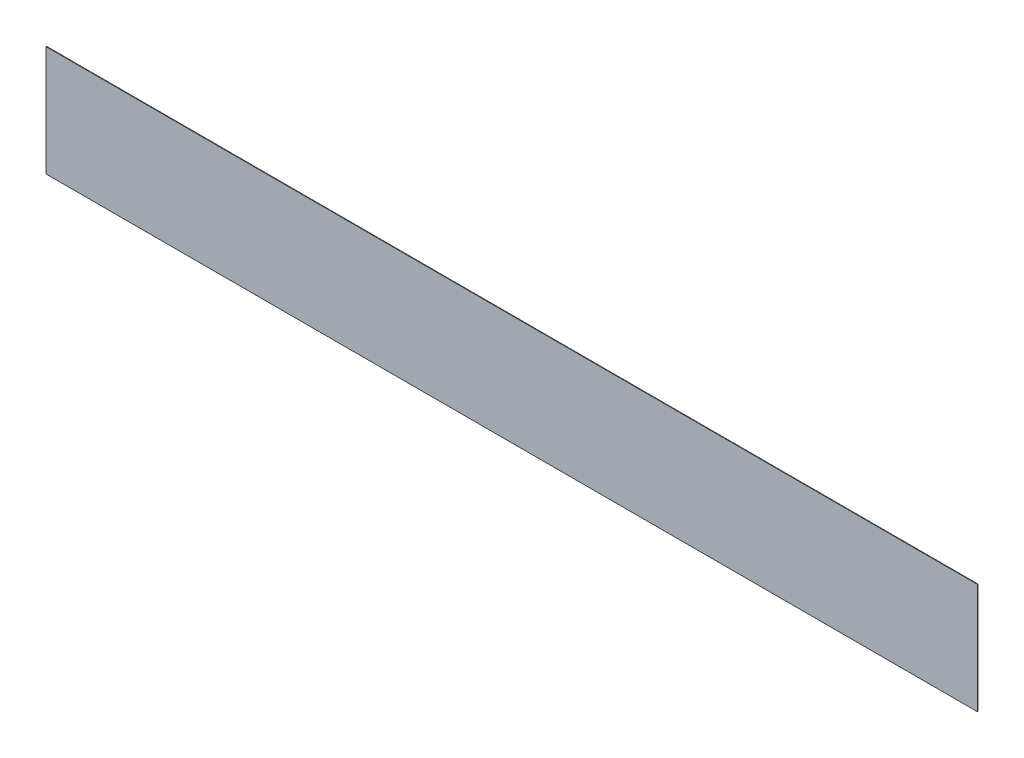
ISO-10303-21;
HEADER;
FILE_DESCRIPTION(('STEP AP214'),'2;1');
FILE_NAME('part.step','',(''),(''),'','','');
FILE_SCHEMA(('AUTOMOTIVE_DESIGN { 1 0 10303 214 1 1 1 1 }'));
ENDSEC;
DATA;
#1=APPLICATION_CONTEXT('core data for automotive mechanical design processes');
#2=APPLICATION_PROTOCOL_DEFINITION('international standard','automotive_design',2000,#1);
#3=PRODUCT_CONTEXT('',#1,'mechanical');
#4=PRODUCT('Part','Part','',(#3));
#5=PRODUCT_RELATED_PRODUCT_CATEGORY('part','',(#4));
#6=PRODUCT_DEFINITION_FORMATION('','',#4);
#7=PRODUCT_DEFINITION_CONTEXT('part definition',#1,'design');
#8=PRODUCT_DEFINITION('design','',#6,#7);
#9=PRODUCT_DEFINITION_SHAPE('','',#8);
#10=(LENGTH_UNIT() NAMED_UNIT(*) SI_UNIT(.MILLI.,.METRE.));
#11=(NAMED_UNIT(*) PLANE_ANGLE_UNIT() SI_UNIT($,.RADIAN.));
#12=(NAMED_UNIT(*) SI_UNIT($,.STERADIAN.) SOLID_ANGLE_UNIT());
#13=UNCERTAINTY_MEASURE_WITH_UNIT(LENGTH_MEASURE(1.E-05),#10,'distance_accuracy_value','');
#14=(GEOMETRIC_REPRESENTATION_CONTEXT(3) GLOBAL_UNCERTAINTY_ASSIGNED_CONTEXT((#13)) GLOBAL_UNIT_ASSIGNED_CONTEXT((#10,
#11,#12)) REPRESENTATION_CONTEXT('',''));
#15=CARTESIAN_POINT('',(0.,0.,0.));
#16=DIRECTION('',(0.,0.,1.));
#17=DIRECTION('',(1.,0.,0.));
#18=AXIS2_PLACEMENT_3D('',#15,#16,#17);
#19=CARTESIAN_POINT('',(650.250000000001,77.0000000000001,-0.8));
#20=DIRECTION('',(1.,0.,0.));
#21=DIRECTION('',(0.,1.,0.));
#22=AXIS2_PLACEMENT_3D('',#19,#20,#21);
#23=PLANE('',#22);
#24=DIRECTION('',(0.,1.,0.));
#25=VECTOR('',#24,1.);
#26=CARTESIAN_POINT('',(650.250000000001,77.0000000000001,0.));
#27=LINE('',#26,#25);
#28=CARTESIAN_POINT('',(650.250000000001,-77.,0.));
#29=VERTEX_POINT('',#28);
#30=CARTESIAN_POINT('',(650.250000000001,77.0000000000001,0.));
#31=VERTEX_POINT('',#30);
#32=EDGE_CURVE('E99',#29,#31,#27,.T.);
#33=ORIENTED_EDGE('',*,*,#32,.F.);
#34=DIRECTION('',(0.,0.,1.));
#35=VECTOR('',#34,1.);
#36=CARTESIAN_POINT('',(650.250000000001,-77.,-0.8));
#37=LINE('',#36,#35);
#38=CARTESIAN_POINT('',(650.250000000001,-77.,-0.8));
#39=VERTEX_POINT('',#38);
#40=EDGE_CURVE('E11',#39,#29,#37,.T.);
#41=ORIENTED_EDGE('',*,*,#40,.F.);
#42=DIRECTION('',(0.,1.,0.));
#43=VECTOR('',#42,1.);
#44=CARTESIAN_POINT('',(650.250000000001,77.0000000000001,-0.8));
#45=LINE('',#44,#43);
#46=CARTESIAN_POINT('',(650.250000000001,77.0000000000001,-0.8));
#47=VERTEX_POINT('',#46);
#48=EDGE_CURVE('E93',#39,#47,#45,.T.);
#49=ORIENTED_EDGE('',*,*,#48,.T.);
#50=DIRECTION('',(0.,0.,1.));
#51=VECTOR('',#50,1.);
#52=CARTESIAN_POINT('',(650.250000000001,77.0000000000001,-0.8));
#53=LINE('',#52,#51);
#54=EDGE_CURVE('E38',#47,#31,#53,.T.);
#55=ORIENTED_EDGE('',*,*,#54,.T.);
#56=EDGE_LOOP('',(#33,#41,#49,#55));
#57=FACE_BOUND('',#56,.T.);
#58=ADVANCED_FACE('F35',(#57),#23,.T.);
#59=CARTESIAN_POINT('',(-650.249999999999,-77.,-0.8));
#60=DIRECTION('',(0.,-1.,0.));
#61=DIRECTION('',(0.,0.,-1.));
#62=AXIS2_PLACEMENT_3D('',#59,#60,#61);
#63=PLANE('',#62);
#64=DIRECTION('',(1.,0.,0.));
#65=VECTOR('',#64,1.);
#66=CARTESIAN_POINT('',(-650.249999999999,-77.,0.));
#67=LINE('',#66,#65);
#68=CARTESIAN_POINT('',(-650.249999999999,-77.,0.));
#69=VERTEX_POINT('',#68);
#70=EDGE_CURVE('E95',#69,#29,#67,.T.);
#71=ORIENTED_EDGE('',*,*,#70,.F.);
#72=DIRECTION('',(0.,0.,1.));
#73=VECTOR('',#72,1.);
#74=CARTESIAN_POINT('',(-650.249999999999,-77.,-0.8));
#75=LINE('',#74,#73);
#76=CARTESIAN_POINT('',(-650.249999999999,-77.,-0.8));
#77=VERTEX_POINT('',#76);
#78=EDGE_CURVE('E44',#77,#69,#75,.T.);
#79=ORIENTED_EDGE('',*,*,#78,.F.);
#80=DIRECTION('',(1.,0.,0.));
#81=VECTOR('',#80,1.);
#82=CARTESIAN_POINT('',(-650.249999999999,-77.,-0.8));
#83=LINE('',#82,#81);
#84=EDGE_CURVE('E90',#77,#39,#83,.T.);
#85=ORIENTED_EDGE('',*,*,#84,.T.);
#86=ORIENTED_EDGE('',*,*,#40,.T.);
#87=EDGE_LOOP('',(#71,#79,#85,#86));
#88=FACE_BOUND('',#87,.T.);
#89=ADVANCED_FACE('F109',(#88),#63,.T.);
#90=CARTESIAN_POINT('',(-650.249999999999,77.0000000000001,-0.8));
#91=DIRECTION('',(-1.,0.,0.));
#92=DIRECTION('',(0.,0.,1.));
#93=AXIS2_PLACEMENT_3D('',#90,#91,#92);
#94=PLANE('',#93);
#95=DIRECTION('',(0.,-1.,0.));
#96=VECTOR('',#95,1.);
#97=CARTESIAN_POINT('',(-650.249999999999,77.0000000000001,0.));
#98=LINE('',#97,#96);
#99=CARTESIAN_POINT('',(-650.249999999999,77.0000000000001,0.));
#100=VERTEX_POINT('',#99);
#101=EDGE_CURVE('E85',#100,#69,#98,.T.);
#102=ORIENTED_EDGE('',*,*,#101,.F.);
#103=DIRECTION('',(0.,0.,1.));
#104=VECTOR('',#103,1.);
#105=CARTESIAN_POINT('',(-650.249999999999,77.0000000000001,-0.8));
#106=LINE('',#105,#104);
#107=CARTESIAN_POINT('',(-650.249999999999,77.0000000000001,-0.8));
#108=VERTEX_POINT('',#107);
#109=EDGE_CURVE('E80',#108,#100,#106,.T.);
#110=ORIENTED_EDGE('',*,*,#109,.F.);
#111=DIRECTION('',(0.,-1.,0.));
#112=VECTOR('',#111,1.);
#113=CARTESIAN_POINT('',(-650.249999999999,77.0000000000001,-0.8));
#114=LINE('',#113,#112);
#115=EDGE_CURVE('E83',#108,#77,#114,.T.);
#116=ORIENTED_EDGE('',*,*,#115,.T.);
#117=ORIENTED_EDGE('',*,*,#78,.T.);
#118=EDGE_LOOP('',(#102,#110,#116,#117));
#119=FACE_BOUND('',#118,.T.);
#120=ADVANCED_FACE('F82',(#119),#94,.T.);
#121=CARTESIAN_POINT('',(-650.249999999999,77.0000000000001,-0.8));
#122=DIRECTION('',(0.,1.,0.));
#123=DIRECTION('',(0.,0.,1.));
#124=AXIS2_PLACEMENT_3D('',#121,#122,#123);
#125=PLANE('',#124);
#126=DIRECTION('',(-1.,0.,0.));
#127=VECTOR('',#126,1.);
#128=CARTESIAN_POINT('',(-650.249999999999,77.0000000000001,0.));
#129=LINE('',#128,#127);
#130=EDGE_CURVE('E102',#31,#100,#129,.T.);
#131=ORIENTED_EDGE('',*,*,#130,.F.);
#132=ORIENTED_EDGE('',*,*,#54,.F.);
#133=DIRECTION('',(-1.,0.,0.));
#134=VECTOR('',#133,1.);
#135=CARTESIAN_POINT('',(-650.249999999999,77.0000000000001,-0.8));
#136=LINE('',#135,#134);
#137=EDGE_CURVE('E89',#47,#108,#136,.T.);
#138=ORIENTED_EDGE('',*,*,#137,.T.);
#139=ORIENTED_EDGE('',*,*,#109,.T.);
#140=EDGE_LOOP('',(#131,#132,#138,#139));
#141=FACE_BOUND('',#140,.T.);
#142=ADVANCED_FACE('F92',(#141),#125,.T.);
#143=CARTESIAN_POINT('',(0.,0.,-0.8));
#144=DIRECTION('',(0.,0.,1.));
#145=DIRECTION('',(1.,0.,0.));
#146=AXIS2_PLACEMENT_3D('',#143,#144,#145);
#147=PLANE('',#146);
#148=ORIENTED_EDGE('',*,*,#48,.F.);
#149=ORIENTED_EDGE('',*,*,#84,.F.);
#150=ORIENTED_EDGE('',*,*,#115,.F.);
#151=ORIENTED_EDGE('',*,*,#137,.F.);
#152=EDGE_LOOP('',(#148,#149,#150,#151));
#153=FACE_BOUND('',#152,.T.);
#154=ADVANCED_FACE('F88',(#153),#147,.F.);
#155=CARTESIAN_POINT('',(0.,0.,0.));
#156=DIRECTION('',(0.,0.,1.));
#157=DIRECTION('',(1.,0.,0.));
#158=AXIS2_PLACEMENT_3D('',#155,#156,#157);
#159=PLANE('',#158);
#160=ORIENTED_EDGE('',*,*,#32,.T.);
#161=ORIENTED_EDGE('',*,*,#130,.T.);
#162=ORIENTED_EDGE('',*,*,#101,.T.);
#163=ORIENTED_EDGE('',*,*,#70,.T.);
#164=EDGE_LOOP('',(#160,#161,#162,#163));
#165=FACE_BOUND('',#164,.T.);
#166=ADVANCED_FACE('F108',(#165),#159,.T.);
#167=CLOSED_SHELL('',(#58,#89,#120,#142,#154,#166));
#168=MANIFOLD_SOLID_BREP('B2',#167);
#169=ADVANCED_BREP_SHAPE_REPRESENTATION('',(#18,#168),#14);
#170=SHAPE_DEFINITION_REPRESENTATION(#9,#169);
ENDSEC;
END-ISO-10303-21;
